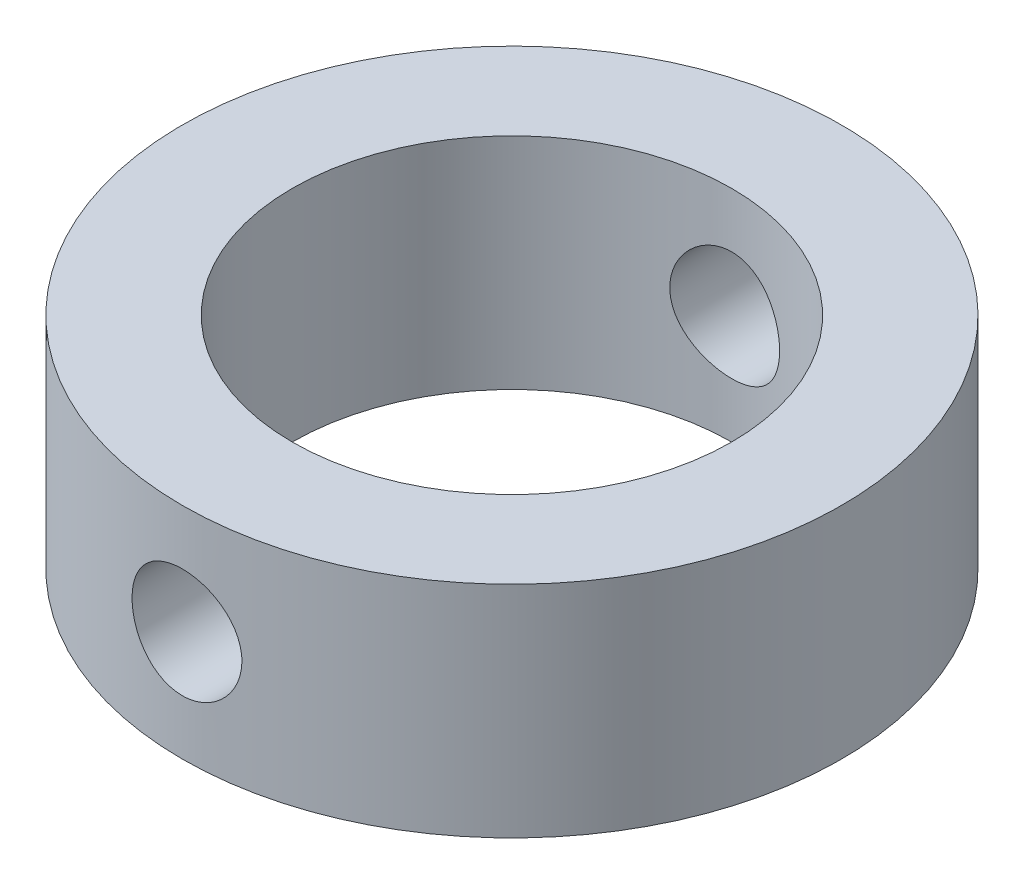
ISO-10303-21;
HEADER;
FILE_DESCRIPTION(('STEP AP214'),'2;1');
FILE_NAME('part.step','',(''),(''),'','','');
FILE_SCHEMA(('AUTOMOTIVE_DESIGN { 1 0 10303 214 1 1 1 1 }'));
ENDSEC;
DATA;
#1=APPLICATION_CONTEXT('core data for automotive mechanical design processes');
#2=APPLICATION_PROTOCOL_DEFINITION('international standard','automotive_design',2000,#1);
#3=PRODUCT_CONTEXT('',#1,'mechanical');
#4=PRODUCT('Part','Part','',(#3));
#5=PRODUCT_RELATED_PRODUCT_CATEGORY('part','',(#4));
#6=PRODUCT_DEFINITION_FORMATION('','',#4);
#7=PRODUCT_DEFINITION_CONTEXT('part definition',#1,'design');
#8=PRODUCT_DEFINITION('design','',#6,#7);
#9=PRODUCT_DEFINITION_SHAPE('','',#8);
#10=(LENGTH_UNIT() NAMED_UNIT(*) SI_UNIT(.MILLI.,.METRE.));
#11=(NAMED_UNIT(*) PLANE_ANGLE_UNIT() SI_UNIT($,.RADIAN.));
#12=(NAMED_UNIT(*) SI_UNIT($,.STERADIAN.) SOLID_ANGLE_UNIT());
#13=UNCERTAINTY_MEASURE_WITH_UNIT(LENGTH_MEASURE(1.E-05),#10,'distance_accuracy_value','');
#14=(GEOMETRIC_REPRESENTATION_CONTEXT(3) GLOBAL_UNCERTAINTY_ASSIGNED_CONTEXT((#13)) GLOBAL_UNIT_ASSIGNED_CONTEXT((#10,
#11,#12)) REPRESENTATION_CONTEXT('',''));
#15=CARTESIAN_POINT('',(0.,0.,0.));
#16=DIRECTION('',(0.,0.,1.));
#17=DIRECTION('',(1.,0.,0.));
#18=AXIS2_PLACEMENT_3D('',#15,#16,#17);
#19=CARTESIAN_POINT('',(0.,10.,0.));
#20=DIRECTION('',(0.,-1.,0.));
#21=DIRECTION('',(0.,0.,-1.));
#22=AXIS2_PLACEMENT_3D('',#19,#20,#21);
#23=CYLINDRICAL_SURFACE('',#22,15.);
#24=CARTESIAN_POINT('',(0.,7.49999999999995,-14.9999999999999));
#25=CARTESIAN_POINT('',(-0.139390904958217,7.49999441105213,-14.9999976116881));
#26=CARTESIAN_POINT('',(-0.278857881838825,7.48830272503106,-14.9980367791303));
#27=CARTESIAN_POINT('',(-0.553880221673049,7.4418643412347,-14.9904034494139));
#28=CARTESIAN_POINT('',(-0.689431867959253,7.40709644308843,-14.9847275392389));
#29=CARTESIAN_POINT('',(-0.952604747212641,7.31558455140728,-14.9703006823645));
#30=CARTESIAN_POINT('',(-1.08023236843189,7.25885853435945,-14.9615522515919));
#31=CARTESIAN_POINT('',(-1.32414184197793,7.12508770794761,-14.9419422708207));
#32=CARTESIAN_POINT('',(-1.44042498987857,7.04804522251701,-14.9310809625443));
#33=CARTESIAN_POINT('',(-1.65947261429168,6.87504491617954,-14.9083331745831));
#34=CARTESIAN_POINT('',(-1.76211290353498,6.77893088536387,-14.8964387181485));
#35=CARTESIAN_POINT('',(-1.94988849865994,6.57085203152717,-14.8730262687673));
#36=CARTESIAN_POINT('',(-2.03502269939099,6.45888620854337,-14.8615082996267));
#37=CARTESIAN_POINT('',(-2.18586712560515,6.22142903380292,-14.8400756575979));
#38=CARTESIAN_POINT('',(-2.25145455286102,6.09585866319524,-14.8301712909164));
#39=CARTESIAN_POINT('',(-2.36055836541121,5.83529043569937,-14.8131978979467));
#40=CARTESIAN_POINT('',(-2.40407624156556,5.70029321632236,-14.8061286801431));
#41=CARTESIAN_POINT('',(-2.46741437778476,5.42601972514344,-14.7957053684276));
#42=CARTESIAN_POINT('',(-2.48744902913539,5.28679426349859,-14.792317684857));
#43=CARTESIAN_POINT('',(-2.5039167252899,5.0069197231165,-14.7895393893665));
#44=CARTESIAN_POINT('',(-2.50035144038902,4.86627074583266,-14.7901484945722));
#45=CARTESIAN_POINT('',(-2.46989509839615,4.58907213872451,-14.7952642886356));
#46=CARTESIAN_POINT('',(-2.44324488188976,4.45249519645474,-14.7997307331892));
#47=CARTESIAN_POINT('',(-2.36775314040344,4.18577868217084,-14.8119949521101));
#48=CARTESIAN_POINT('',(-2.31891085431977,4.05563933111142,-14.8197928407328));
#49=CARTESIAN_POINT('',(-2.20017724609395,3.80477117655906,-14.8378847933411));
#50=CARTESIAN_POINT('',(-2.13018591387973,3.68409059391878,-14.8481906710733));
#51=CARTESIAN_POINT('',(-1.97121201755744,3.45609559946165,-14.8701291841501));
#52=CARTESIAN_POINT('',(-1.8822279206543,3.34878226754512,-14.8817619265428));
#53=CARTESIAN_POINT('',(-1.68648221215908,3.1491739141927,-14.9052202787978));
#54=CARTESIAN_POINT('',(-1.57951396387316,3.05708148145995,-14.9170464923165));
#55=CARTESIAN_POINT('',(-1.35153524898167,2.89212223733468,-14.9394260139672));
#56=CARTESIAN_POINT('',(-1.23052469190643,2.81925554981679,-14.9499793138974));
#57=CARTESIAN_POINT('',(-0.97770591616671,2.69479777286373,-14.9686389289291));
#58=CARTESIAN_POINT('',(-0.845888725564658,2.64322458066875,-14.9767431840745));
#59=CARTESIAN_POINT('',(-0.575298345602716,2.56300578475402,-14.9895750301266));
#60=CARTESIAN_POINT('',(-0.436525739179443,2.53435826302628,-14.9943029035047));
#61=CARTESIAN_POINT('',(-0.1577099013016,2.50107864153887,-14.9998112984268));
#62=CARTESIAN_POINT('',(-0.0177007371510007,2.49616842819439,-15.0006375301278));
#63=CARTESIAN_POINT('',(0.261139772889873,2.50976134442813,-14.9983747442117));
#64=CARTESIAN_POINT('',(0.399971163892011,2.52826357313376,-14.9952858772412));
#65=CARTESIAN_POINT('',(0.671656175546734,2.5879248493355,-14.985568269382));
#66=CARTESIAN_POINT('',(0.804540868385359,2.62894620839014,-14.9789610480131));
#67=CARTESIAN_POINT('',(1.06154688486045,2.73233451819952,-14.9629446445536));
#68=CARTESIAN_POINT('',(1.18566771590974,2.79470266763524,-14.9535353051201));
#69=CARTESIAN_POINT('',(1.42283068946898,2.93965112469677,-14.932845163024));
#70=CARTESIAN_POINT('',(1.53576525093716,3.02240515616727,-14.9215485588702));
#71=CARTESIAN_POINT('',(1.74624358550271,3.20553731538509,-14.898384673919));
#72=CARTESIAN_POINT('',(1.84378623969663,3.30591672327668,-14.8865173517155));
#73=CARTESIAN_POINT('',(2.02174277965805,3.52269754807143,-14.8634017523585));
#74=CARTESIAN_POINT('',(2.10196876111373,3.63925416551443,-14.8521611613711));
#75=CARTESIAN_POINT('',(2.24170231029498,3.88435296913855,-14.8317152977788));
#76=CARTESIAN_POINT('',(2.30121053476982,4.0128947752275,-14.8225099606602));
#77=CARTESIAN_POINT('',(2.39753833147314,4.27778973281212,-14.807234536977));
#78=CARTESIAN_POINT('',(2.43445143254793,4.41410809503047,-14.8011515431106));
#79=CARTESIAN_POINT('',(2.48483545377828,4.69112012922173,-14.7927771683526));
#80=CARTESIAN_POINT('',(2.4983084119462,4.83181341973201,-14.7904854578272));
#81=CARTESIAN_POINT('',(2.50137286604739,5.11170516596237,-14.7899673308401));
#82=CARTESIAN_POINT('',(2.4912601361252,5.25090037857526,-14.7916905650565));
#83=CARTESIAN_POINT('',(2.44807983895684,5.52557924805076,-14.7988978145373));
#84=CARTESIAN_POINT('',(2.41501234611246,5.66106291694188,-14.8043818176121));
#85=CARTESIAN_POINT('',(2.32697448959488,5.92435843729263,-14.8184735628172));
#86=CARTESIAN_POINT('',(2.27202959060042,6.05217901005605,-14.8270776721967));
#87=CARTESIAN_POINT('',(2.14182700391591,6.29683566919487,-14.8464436892221));
#88=CARTESIAN_POINT('',(2.06656830874858,6.41367121037216,-14.8572057038841));
#89=CARTESIAN_POINT('',(1.89681888437217,6.63453558310777,-14.8798345404563));
#90=CARTESIAN_POINT('',(1.80211056359365,6.73839601670027,-14.8917129557631));
#91=CARTESIAN_POINT('',(1.59660903138023,6.92885160447494,-14.9151437236084));
#92=CARTESIAN_POINT('',(1.48581211291265,7.01544276863821,-14.9266960002654));
#93=CARTESIAN_POINT('',(1.25036916964029,7.16944826819998,-14.9482652964222));
#94=CARTESIAN_POINT('',(1.12563278753281,7.23672603931296,-14.9582711625311));
#95=CARTESIAN_POINT('',(0.866513069378964,7.34926948460993,-14.9755116760177));
#96=CARTESIAN_POINT('',(0.73213949483,7.39455708107975,-14.9827490817747));
#97=CARTESIAN_POINT('',(0.497703310045395,7.45200527412671,-14.9920579083295));
#98=CARTESIAN_POINT('',(0.399058830298444,7.46997446961599,-14.9950202727336));
#99=CARTESIAN_POINT('',(0.200289310319808,7.49397373784473,-14.9989921598612));
#100=CARTESIAN_POINT('',(0.100164295608494,7.50000401613732,-15.0000017162063));
#101=CARTESIAN_POINT('',(0.,7.49999999999995,-14.9999999999999));
#102=B_SPLINE_CURVE_WITH_KNOTS('',3,(#24,#25,#26,#27,#28,#29,#30,#31,#32,#33,#34,#35,#36,#37,
#38,#39,#40,#41,#42,#43,#44,#45,#46,#47,#48,#49,#50,#51,#52,#53,#54,#55,#56,#57,#58,#59,#60,#61,
#62,#63,#64,#65,#66,#67,#68,#69,#70,#71,#72,#73,#74,#75,#76,#77,#78,#79,#80,#81,#82,#83,#84,#85,
#86,#87,#88,#89,#90,#91,#92,#93,#94,#95,#96,#97,#98,#99,#100,#101),.UNSPECIFIED.,.T.,.F.,(4,2,2,
2,2,2,2,2,2,2,2,2,2,2,2,2,2,2,2,2,2,2,2,2,2,2,2,2,2,2,2,2,2,2,2,2,2,2,4),(0.,0.417806584938513,
0.835997545695406,1.25384686702525,1.67164841267478,2.09302491062334,2.5144280016986,
2.93842520823841,3.3623937687618,3.78246077103425,4.2024980432089,4.61820521760411,
5.03392665025383,5.45164556632555,5.86939820680567,6.29232769911323,6.71525991635846,
7.13854688915903,7.56179844521151,7.98007883491396,8.39834313035855,8.81407807006413,
9.22983635826067,9.64926825627025,10.0687306305429,10.4925382200762,10.9163323737594,
11.3383602234177,11.7603513778661,12.177079095227,12.5938054618814,13.0100481822622,
13.4263115502934,13.8475138419339,14.2688133387897,14.693022316072,15.1168075213007,
15.4170424816402,15.7172722727697),.UNSPECIFIED.);
#103=CARTESIAN_POINT('',(0.,7.49999999999995,-14.9999999999999));
#104=VERTEX_POINT('',#103);
#105=EDGE_CURVE('E95',#104,#104,#102,.T.);
#106=ORIENTED_EDGE('',*,*,#105,.T.);
#107=EDGE_LOOP('',(#106));
#108=FACE_BOUND('',#107,.T.);
#109=CARTESIAN_POINT('',(2.49999999999995,5.,14.7901994577491));
#110=CARTESIAN_POINT('',(2.49999439841976,4.86062425183819,14.7902019736661));
#111=CARTESIAN_POINT('',(2.48830516902826,4.72117239392853,14.7921909238523));
#112=CARTESIAN_POINT('',(2.44187742806639,4.44618145673683,14.7999245720004));
#113=CARTESIAN_POINT('',(2.40711766030862,4.31064610624194,14.8056727334638));
#114=CARTESIAN_POINT('',(2.31562954367049,4.0475077166584,14.8202560936732));
#115=CARTESIAN_POINT('',(2.25891955493198,3.91989815133776,14.8290887118401));
#116=CARTESIAN_POINT('',(2.12518649688946,3.67601904528221,14.8488427210228));
#117=CARTESIAN_POINT('',(2.04816571350133,3.55974823042263,14.8597638769422));
#118=CARTESIAN_POINT('',(1.87518752696654,3.3406871502554,14.8825847115587));
#119=CARTESIAN_POINT('',(1.77906904893232,3.23802486861377,14.8944921732794));
#120=CARTESIAN_POINT('',(1.57097200469525,3.05020669313817,14.9178748066858));
#121=CARTESIAN_POINT('',(1.45899249914995,2.96505183688455,14.9293499527174));
#122=CARTESIAN_POINT('',(1.22152286994834,2.81418543278071,14.9506573698271));
#123=CARTESIAN_POINT('',(1.0959560814567,2.7485929922682,14.9604794243234));
#124=CARTESIAN_POINT('',(0.835395621723878,2.63947892946945,14.9772873695709));
#125=CARTESIAN_POINT('',(0.700402564078215,2.59595587211511,14.9842734447265));
#126=CARTESIAN_POINT('',(0.426143726344286,2.53260746501609,14.9945673472439));
#127=CARTESIAN_POINT('',(0.286928886679313,2.51256708399531,14.997908531109));
#128=CARTESIAN_POINT('',(0.00707528552583672,2.49608424584742,15.0006507934278));
#129=CARTESIAN_POINT('',(-0.133563378528861,2.49964018475278,15.0000521396932));
#130=CARTESIAN_POINT('',(-0.410802185078846,2.53008135152823,14.995008584314));
#131=CARTESIAN_POINT('',(-0.547428530700116,2.55673516340917,14.990601836924));
#132=CARTESIAN_POINT('',(-0.814241979611803,2.63225107424648,14.9784797877164));
#133=CARTESIAN_POINT('',(-0.944428886651547,2.68111384958946,14.9707643851322));
#134=CARTESIAN_POINT('',(-1.19535614778268,2.79989064031529,14.9528269851197));
#135=CARTESIAN_POINT('',(-1.31605052301905,2.86990001208245,14.9425936732688));
#136=CARTESIAN_POINT('',(-1.54406552984664,3.02891282263505,14.9207573807149));
#137=CARTESIAN_POINT('',(-1.65138507791591,3.11791779871077,14.9091542891914));
#138=CARTESIAN_POINT('',(-1.85097127344671,3.31367880661925,14.885702682326));
#139=CARTESIAN_POINT('',(-1.94303950225322,3.42063709490096,14.8738528973104));
#140=CARTESIAN_POINT('',(-2.10795458844804,3.64858709021583,14.851379597848));
#141=CARTESIAN_POINT('',(-2.18080126853238,3.76957892668284,14.8407560947132));
#142=CARTESIAN_POINT('',(-2.30524443448827,4.0223916418775,14.8219375456181));
#143=CARTESIAN_POINT('',(-2.35681702727925,4.15422449809211,14.813745233026));
#144=CARTESIAN_POINT('',(-2.43702987081562,4.42484907230757,14.8007618868988));
#145=CARTESIAN_POINT('',(-2.46567214076791,4.56364017643246,14.7959705538833));
#146=CARTESIAN_POINT('',(-2.49893188487922,4.84246615616217,14.7903895942213));
#147=CARTESIAN_POINT('',(-2.50383220791244,4.98246637970212,14.7895528575867));
#148=CARTESIAN_POINT('',(-2.49022270268246,5.2612866716908,14.7918503478236));
#149=CARTESIAN_POINT('',(-2.47171377862463,5.40010678551393,14.7949844213186));
#150=CARTESIAN_POINT('',(-2.41205233492806,5.67172775919081,14.8048268745503));
#151=CARTESIAN_POINT('',(-2.37104379064638,5.80456113987798,14.8115125191835));
#152=CARTESIAN_POINT('',(-2.26769819019231,6.06147016627946,14.827685730055));
#153=CARTESIAN_POINT('',(-2.20535985810097,6.18554528755087,14.8371734639058));
#154=CARTESIAN_POINT('',(-2.06045667322926,6.42267459440609,14.857991283974));
#155=CARTESIAN_POINT('',(-1.97771056415939,6.53561657275605,14.8693375560035));
#156=CARTESIAN_POINT('',(-1.79458946570798,6.74611353269499,14.8925466667987));
#157=CARTESIAN_POINT('',(-1.69421323638402,6.84366743110971,14.9044095418534));
#158=CARTESIAN_POINT('',(-1.47742807032877,7.02165189272868,14.9274642211827));
#159=CARTESIAN_POINT('',(-1.36086325338617,7.10189382628455,14.9386477634468));
#160=CARTESIAN_POINT('',(-1.1157434479493,7.24165532700492,14.9589511243294));
#161=CARTESIAN_POINT('',(-0.98718884747059,7.3011755644739,14.9680710096997));
#162=CARTESIAN_POINT('',(-0.722299051501287,7.3975105839549,14.9831835816957));
#163=CARTESIAN_POINT('',(-0.586000562602573,7.43442407573495,14.9891898456761));
#164=CARTESIAN_POINT('',(-0.309030734874174,7.48481559896383,14.9974558316929));
#165=CARTESIAN_POINT('',(-0.16835975682158,7.49829555873233,14.999715862002));
#166=CARTESIAN_POINT('',(0.111541275773708,7.50138188231217,15.0002303788782));
#167=CARTESIAN_POINT('',(0.250768160602686,7.49127525394107,14.9985330202419));
#168=CARTESIAN_POINT('',(0.525511974314703,7.44809607773059,14.9914217838733));
#169=CARTESIAN_POINT('',(0.661028923967465,7.41502365849036,14.9860079269519));
#170=CARTESIAN_POINT('',(0.924396445918518,7.32696183445639,14.9720698882741));
#171=CARTESIAN_POINT('',(1.05225537215381,7.27199683178999,14.9635491704088));
#172=CARTESIAN_POINT('',(1.29698045298214,7.14174206376941,14.9443275687803));
#173=CARTESIAN_POINT('',(1.41384608611817,7.06645133493751,14.933626581674));
#174=CARTESIAN_POINT('',(1.63471294552637,6.89666490753944,14.911076296164));
#175=CARTESIAN_POINT('',(1.73855143060276,6.80195904524871,14.8992152454112));
#176=CARTESIAN_POINT('',(1.92896387595096,6.59647169209616,14.8757630331437));
#177=CARTESIAN_POINT('',(2.01553378671195,6.48568644108743,14.8641719354951));
#178=CARTESIAN_POINT('',(2.1695142709109,6.25025467751034,14.8424834353391));
#179=CARTESIAN_POINT('',(2.23678498905773,6.12551566023447,14.8323971784578));
#180=CARTESIAN_POINT('',(2.34931453640428,5.86639076416181,14.8149921009131));
#181=CARTESIAN_POINT('',(2.39459535522306,5.73201467732259,14.8076705172487));
#182=CARTESIAN_POINT('',(2.45202605312742,5.49759623051258,14.7982474485648));
#183=CARTESIAN_POINT('',(2.4699874176714,5.39897319203737,14.7952462341946));
#184=CARTESIAN_POINT('',(2.49397629518131,5.20024651516306,14.7912213528807));
#185=CARTESIAN_POINT('',(2.50000402479273,5.1001429036758,14.7901976500369));
#186=CARTESIAN_POINT('',(2.49999999999995,5.,14.7901994577491));
#187=B_SPLINE_CURVE_WITH_KNOTS('',3,(#109,#110,#111,#112,#113,#114,#115,#116,#117,#118,#119,
#120,#121,#122,#123,#124,#125,#126,#127,#128,#129,#130,#131,#132,#133,#134,#135,#136,#137,#138,
#139,#140,#141,#142,#143,#144,#145,#146,#147,#148,#149,#150,#151,#152,#153,#154,#155,#156,#157,
#158,#159,#160,#161,#162,#163,#164,#165,#166,#167,#168,#169,#170,#171,#172,#173,#174,#175,#176,
#177,#178,#179,#180,#181,#182,#183,#184,#185,#186),.UNSPECIFIED.,.T.,.F.,(4,2,2,2,2,2,2,2,2,2,2,
2,2,2,2,2,2,2,2,2,2,2,2,2,2,2,2,2,2,2,2,2,2,2,2,2,2,2,4),(0.,0.417761038927738,
0.835907519962961,1.25370499787519,1.67145547405276,2.09289159155717,2.51435267834451,
2.93832980111435,3.36227935111109,3.78231567472561,4.20232344652688,4.61817121164668,
5.03403164249535,5.45179604139427,5.86959426226764,6.29246123462125,6.71533210746022,
7.13867662498607,7.56198385938082,7.98023542420411,8.39847083413972,8.81406064635488,
9.22967532293571,9.649123427627,10.0686010443069,10.4924411303538,10.916267504767,
11.3382298441765,11.7601574591235,12.1769777626592,12.5937957321882,13.0101503983245,
13.4265248039234,13.8476699746326,14.2689137888182,14.6931372761832,15.1169356674446,
15.4171067054377,15.7172722940182),.UNSPECIFIED.);
#188=CARTESIAN_POINT('',(2.49999999999995,5.,14.7901994577491));
#189=VERTEX_POINT('',#188);
#190=EDGE_CURVE('E88',#189,#189,#187,.T.);
#191=ORIENTED_EDGE('',*,*,#190,.T.);
#192=EDGE_LOOP('',(#191));
#193=FACE_BOUND('',#192,.T.);
#194=CARTESIAN_POINT('',(0.,10.,0.));
#195=DIRECTION('',(0.,1.,0.));
#196=DIRECTION('',(0.,0.,1.));
#197=AXIS2_PLACEMENT_3D('',#194,#195,#196);
#198=CIRCLE('',#197,15.);
#199=CARTESIAN_POINT('',(0.,10.,15.));
#200=VERTEX_POINT('',#199);
#201=EDGE_CURVE('E10',#200,#200,#198,.T.);
#202=ORIENTED_EDGE('',*,*,#201,.F.);
#203=EDGE_LOOP('',(#202));
#204=FACE_BOUND('',#203,.T.);
#205=CARTESIAN_POINT('',(0.,0.,0.));
#206=DIRECTION('',(0.,1.,0.));
#207=DIRECTION('',(0.,0.,1.));
#208=AXIS2_PLACEMENT_3D('',#205,#206,#207);
#209=CIRCLE('',#208,15.);
#210=CARTESIAN_POINT('',(0.,0.,15.));
#211=VERTEX_POINT('',#210);
#212=EDGE_CURVE('E54',#211,#211,#209,.T.);
#213=ORIENTED_EDGE('',*,*,#212,.T.);
#214=EDGE_LOOP('',(#213));
#215=FACE_BOUND('',#214,.T.);
#216=ADVANCED_FACE('F41',(#108,#193,#204,#215),#23,.T.);
#217=CARTESIAN_POINT('',(0.,10.,0.));
#218=DIRECTION('',(0.,1.,0.));
#219=DIRECTION('',(0.,0.,1.));
#220=AXIS2_PLACEMENT_3D('',#217,#218,#219);
#221=PLANE('',#220);
#222=CARTESIAN_POINT('',(0.,10.,0.));
#223=DIRECTION('',(0.,1.,0.));
#224=DIRECTION('',(0.,0.,1.));
#225=AXIS2_PLACEMENT_3D('',#222,#223,#224);
#226=CIRCLE('',#225,10.);
#227=CARTESIAN_POINT('',(0.,10.,10.));
#228=VERTEX_POINT('',#227);
#229=EDGE_CURVE('E63',#228,#228,#226,.T.);
#230=ORIENTED_EDGE('',*,*,#229,.F.);
#231=EDGE_LOOP('',(#230));
#232=FACE_BOUND('',#231,.T.);
#233=ORIENTED_EDGE('',*,*,#201,.T.);
#234=EDGE_LOOP('',(#233));
#235=FACE_BOUND('',#234,.T.);
#236=ADVANCED_FACE('F108',(#232,#235),#221,.T.);
#237=CARTESIAN_POINT('',(0.,0.,0.));
#238=DIRECTION('',(0.,1.,0.));
#239=DIRECTION('',(0.,0.,1.));
#240=AXIS2_PLACEMENT_3D('',#237,#238,#239);
#241=PLANE('',#240);
#242=CARTESIAN_POINT('',(0.,0.,0.));
#243=DIRECTION('',(0.,1.,0.));
#244=DIRECTION('',(0.,0.,1.));
#245=AXIS2_PLACEMENT_3D('',#242,#243,#244);
#246=CIRCLE('',#245,10.);
#247=CARTESIAN_POINT('',(0.,0.,10.));
#248=VERTEX_POINT('',#247);
#249=EDGE_CURVE('E65',#248,#248,#246,.T.);
#250=ORIENTED_EDGE('',*,*,#249,.T.);
#251=EDGE_LOOP('',(#250));
#252=FACE_BOUND('',#251,.T.);
#253=ORIENTED_EDGE('',*,*,#212,.F.);
#254=EDGE_LOOP('',(#253));
#255=FACE_BOUND('',#254,.T.);
#256=ADVANCED_FACE('F112',(#252,#255),#241,.F.);
#257=CARTESIAN_POINT('',(0.,0.,0.));
#258=DIRECTION('',(0.,1.,0.));
#259=DIRECTION('',(0.,0.,1.));
#260=AXIS2_PLACEMENT_3D('',#257,#258,#259);
#261=CYLINDRICAL_SURFACE('',#260,10.);
#262=CARTESIAN_POINT('',(0.,2.49999999999995,10.));
#263=CARTESIAN_POINT('',(0.13812681444954,2.50000387623021,9.99999766446687));
#264=CARTESIAN_POINT('',(0.276296929717914,2.5114859179563,9.99710963553043));
#265=CARTESIAN_POINT('',(0.548677206284179,2.55704191884502,9.98586856383158));
#266=CARTESIAN_POINT('',(0.682885078117852,2.59112868256307,9.9775124236663));
#267=CARTESIAN_POINT('',(0.943368120304257,2.68073208910344,9.95626043886723));
#268=CARTESIAN_POINT('',(1.06965260571665,2.73622299785875,9.94337004736764));
#269=CARTESIAN_POINT('',(1.31112021984069,2.86696898340808,9.91442239679369));
#270=CARTESIAN_POINT('',(1.42630297391457,2.94222472686499,9.89836503090265));
#271=CARTESIAN_POINT('',(1.64466987883484,3.11200131609035,9.86445689319493));
#272=CARTESIAN_POINT('',(1.74759281676843,3.20685262493179,9.84657845246878));
#273=CARTESIAN_POINT('',(1.93624821200554,3.41242034151506,9.81122700196559));
#274=CARTESIAN_POINT('',(2.02197872824863,3.52313853824492,9.79375403816447));
#275=CARTESIAN_POINT('',(2.17504423799826,3.75932537789502,9.76091292830282));
#276=CARTESIAN_POINT('',(2.24208702654188,3.88498871801456,9.74557990774685));
#277=CARTESIAN_POINT('',(2.3539948475846,4.14624735276671,9.71915824696694));
#278=CARTESIAN_POINT('',(2.39886342573363,4.28184105555334,9.70806892824032));
#279=CARTESIAN_POINT('',(2.46425806134132,4.55623916366941,9.69167461160541));
#280=CARTESIAN_POINT('',(2.48525378055343,4.69492482672997,9.68625818328355));
#281=CARTESIAN_POINT('',(2.50376962511067,4.97394761499891,9.68148937432649));
#282=CARTESIAN_POINT('',(2.50129356969688,5.11428446782023,9.68213600713204));
#283=CARTESIAN_POINT('',(2.47331087439955,5.38902634624225,9.68932009194685));
#284=CARTESIAN_POINT('',(2.44836390031775,5.52349270244221,9.69571438345487));
#285=CARTESIAN_POINT('',(2.37704031150497,5.78626841818506,9.7134451611845));
#286=CARTESIAN_POINT('',(2.33066217011562,5.91457733838149,9.72478199948729));
#287=CARTESIAN_POINT('',(2.21731579656195,6.16289669375351,9.75125189842761));
#288=CARTESIAN_POINT('',(2.15014444538821,6.28281028631594,9.7664221244969));
#289=CARTESIAN_POINT('',(1.99726046002492,6.50986451626136,9.79882851409987));
#290=CARTESIAN_POINT('',(1.91154458134804,6.61700291344538,9.81606503891053));
#291=CARTESIAN_POINT('',(1.721105707802,6.81867269282397,9.85126467566491));
#292=CARTESIAN_POINT('',(1.61591043027642,6.91275748343558,9.86923449130001));
#293=CARTESIAN_POINT('',(1.39101986250618,7.08203540410652,9.90343275964594));
#294=CARTESIAN_POINT('',(1.27132412951325,7.15722795710594,9.91966115915687));
#295=CARTESIAN_POINT('',(1.02019314780232,7.28675097704064,9.94862886823658));
#296=CARTESIAN_POINT('',(0.88871898868103,7.34100890042405,9.96135600212879));
#297=CARTESIAN_POINT('',(0.618126680238109,7.4265288428493,9.98179861652361));
#298=CARTESIAN_POINT('',(0.479009998584106,7.45779526069691,9.98951505565475));
#299=CARTESIAN_POINT('',(0.200899950650008,7.49576260926474,9.99892498785634));
#300=CARTESIAN_POINT('',(0.0619945333136518,7.50307171012551,10.0007675584713));
#301=CARTESIAN_POINT('',(-0.215054791335862,7.49458499657419,9.99864674690749));
#302=CARTESIAN_POINT('',(-0.353198766074329,7.47879126200143,9.99468388736412));
#303=CARTESIAN_POINT('',(-0.622690447960817,7.42504848601437,9.98149301878911));
#304=CARTESIAN_POINT('',(-0.754108531614592,7.38743122753839,9.97234390309646));
#305=CARTESIAN_POINT('',(-1.00876215408752,7.29148819328589,9.94981177723596));
#306=CARTESIAN_POINT('',(-1.13199686505439,7.23316032614459,9.93642833949961));
#307=CARTESIAN_POINT('',(-1.36920522404969,7.09627311854217,9.90655513210366));
#308=CARTESIAN_POINT('',(-1.48297573639295,7.01737314600572,9.89001445611001));
#309=CARTESIAN_POINT('',(-1.69587768940553,6.84201681867139,9.85574181979585));
#310=CARTESIAN_POINT('',(-1.79500659828873,6.74555743397057,9.83800965421567));
#311=CARTESIAN_POINT('',(-1.97831761345412,6.53499673192712,9.80281594932487));
#312=CARTESIAN_POINT('',(-2.06207311270184,6.4205204950007,9.78537173637462));
#313=CARTESIAN_POINT('',(-2.20918459835607,6.17877894255235,9.75321463970069));
#314=CARTESIAN_POINT('',(-2.27254149026904,6.05151419504925,9.73850163474933));
#315=CARTESIAN_POINT('',(-2.37658570101225,5.78849046265626,9.71363491194656));
#316=CARTESIAN_POINT('',(-2.41740732773931,5.65278728614616,9.70345425375806));
#317=CARTESIAN_POINT('',(-2.47557609990489,5.3761506035745,9.68877906706588));
#318=CARTESIAN_POINT('',(-2.49292837912653,5.23521824829759,9.68428329504046));
#319=CARTESIAN_POINT('',(-2.50339765056084,4.95646496023066,9.68158168701614));
#320=CARTESIAN_POINT('',(-2.49719649630133,4.81867094145593,9.68319887888036));
#321=CARTESIAN_POINT('',(-2.46229546385365,4.54616018555623,9.69213181672141));
#322=CARTESIAN_POINT('',(-2.43359603781095,4.41144338664469,9.69944744817726));
#323=CARTESIAN_POINT('',(-2.35488553240492,4.14965256822357,9.71885434473215));
#324=CARTESIAN_POINT('',(-2.30500234113403,4.02253782459946,9.73091692061053));
#325=CARTESIAN_POINT('',(-2.18544152267505,3.77839102881074,9.75846259540843));
#326=CARTESIAN_POINT('',(-2.11576115005698,3.66136037802189,9.77394616867816));
#327=CARTESIAN_POINT('',(-1.9564462477286,3.43740895166327,9.80709390439346));
#328=CARTESIAN_POINT('',(-1.86633860485378,3.33083154429342,9.82480441386306));
#329=CARTESIAN_POINT('',(-1.66964895198291,3.13408825867435,9.86013378743765));
#330=CARTESIAN_POINT('',(-1.56306303543527,3.04392628314506,9.87775262878415));
#331=CARTESIAN_POINT('',(-1.33411264450435,2.88098115239232,9.91129426079445));
#332=CARTESIAN_POINT('',(-1.21149737052734,2.80854231054738,9.92718055609783));
#333=CARTESIAN_POINT('',(-0.955443432517482,2.68542089509914,9.95508208291861));
#334=CARTESIAN_POINT('',(-0.822012605727916,2.63472273225245,9.96710008666296));
#335=CARTESIAN_POINT('',(-0.574017088739129,2.56404694945059,9.98413432609231));
#336=CARTESIAN_POINT('',(-0.46063361818012,2.54008126157763,9.99004308421149));
#337=CARTESIAN_POINT('',(-0.23151011922714,2.50805676063009,9.99797675386582));
#338=CARTESIAN_POINT('',(-0.115770268737694,2.49999675115778,10.0000019575149));
#339=CARTESIAN_POINT('',(0.,2.49999999999995,10.));
#340=B_SPLINE_CURVE_WITH_KNOTS('',3,(#262,#263,#264,#265,#266,#267,#268,#269,#270,#271,#272,
#273,#274,#275,#276,#277,#278,#279,#280,#281,#282,#283,#284,#285,#286,#287,#288,#289,#290,#291,
#292,#293,#294,#295,#296,#297,#298,#299,#300,#301,#302,#303,#304,#305,#306,#307,#308,#309,#310,
#311,#312,#313,#314,#315,#316,#317,#318,#319,#320,#321,#322,#323,#324,#325,#326,#327,#328,#329,
#330,#331,#332,#333,#334,#335,#336,#337,#338,#339),.UNSPECIFIED.,.T.,.F.,(4,2,2,2,2,2,2,2,2,2,2,
2,2,2,2,2,2,2,2,2,2,2,2,2,2,2,2,2,2,2,2,2,2,2,2,2,2,2,4),(0.,0.413956187453119,
0.828147062939779,1.24184150381016,1.65554990028223,2.07690725728566,2.4983121596677,
2.92597745909677,3.35357435282278,3.77260491835115,4.19156730193363,4.6003749501723,
5.00921172448929,5.42217546461999,5.83521151399139,6.26002501620566,6.68485149269278,
7.11113715020726,7.53734122819944,7.95263848254331,8.36789835193439,8.7770045752893,
9.18615212209351,9.60255979281121,10.0190393835223,10.44574182013,10.8724253125472,
11.2965375769764,11.7205570543047,12.1323963400748,12.5442273493652,12.9536066760887,
13.3630428023796,13.7831596069298,14.2033761629382,14.6312030917577,15.0587227304538,
15.4057040491338,15.7526592674819),.UNSPECIFIED.);
#341=CARTESIAN_POINT('',(0.,2.49999999999995,10.));
#342=VERTEX_POINT('',#341);
#343=EDGE_CURVE('E44',#342,#342,#340,.T.);
#344=ORIENTED_EDGE('',*,*,#343,.T.);
#345=EDGE_LOOP('',(#344));
#346=FACE_BOUND('',#345,.T.);
#347=CARTESIAN_POINT('',(2.49999999999995,5.,-9.68245836551862));
#348=CARTESIAN_POINT('',(2.49999607859301,4.86194924907342,-9.68246100087868));
#349=CARTESIAN_POINT('',(2.48852624549764,4.72385510132147,-9.68544306014599));
#350=CARTESIAN_POINT('',(2.4430231254638,4.45163242182649,-9.69701861992562));
#351=CARTESIAN_POINT('',(2.40897670674207,4.31750624553183,-9.70561538621631));
#352=CARTESIAN_POINT('',(2.31949119963199,4.05719646181284,-9.72738724596152));
#353=CARTESIAN_POINT('',(2.26407972785447,3.93100284461431,-9.74055642690458));
#354=CARTESIAN_POINT('',(2.13352114126142,3.68968914746013,-9.76998192028758));
#355=CARTESIAN_POINT('',(2.05837318856074,3.57456953791979,-9.78623836378488));
#356=CARTESIAN_POINT('',(1.88870842731193,3.3561383547378,-9.82040716355624));
#357=CARTESIAN_POINT('',(1.79383688770407,3.25310639964998,-9.83834597623032));
#358=CARTESIAN_POINT('',(1.58818206410068,3.06423860563967,-9.87362875515295));
#359=CARTESIAN_POINT('',(1.47739729418035,2.97840437437821,-9.89097266566394));
#360=CARTESIAN_POINT('',(1.241145201079,2.82522453236867,-9.92340415520588));
#361=CARTESIAN_POINT('',(1.11549457619512,2.75815361183852,-9.93845687400593));
#362=CARTESIAN_POINT('',(0.854263184292725,2.64619035584693,-9.96430811925983));
#363=CARTESIAN_POINT('',(0.7186838857919,2.6012947480845,-9.97510727334348));
#364=CARTESIAN_POINT('',(0.444358758754115,2.53585216542142,-9.99104758848185));
#365=CARTESIAN_POINT('',(0.305732719548926,2.51483035567341,-9.99629893844317));
#366=CARTESIAN_POINT('',(0.0268288192627162,2.49624162072445,-10.000935941073));
#367=CARTESIAN_POINT('',(-0.113448794538122,2.49867122779043,-10.000322460967));
#368=CARTESIAN_POINT('',(-0.388380617931014,2.52657485025019,-9.99338094953529));
#369=CARTESIAN_POINT('',(-0.523090539002705,2.55153632505389,-9.9871800234087));
#370=CARTESIAN_POINT('',(-0.78634561853424,2.62297127004849,-9.96990836524857));
#371=CARTESIAN_POINT('',(-0.914890448426113,2.66944588537738,-9.95883737398449));
#372=CARTESIAN_POINT('',(-1.16351675875452,2.78300257068704,-9.9328750970088));
#373=CARTESIAN_POINT('',(-1.28351127441626,2.85026704466173,-9.91795019695009));
#374=CARTESIAN_POINT('',(-1.51068905585121,3.00335567911626,-9.88589903809694));
#375=CARTESIAN_POINT('',(-1.61787008771375,3.08918306856063,-9.86877239652653));
#376=CARTESIAN_POINT('',(-1.81943508771238,3.27970874198236,-9.83363713769357));
#377=CARTESIAN_POINT('',(-1.91339419768799,3.38485489234773,-9.81561719525295));
#378=CARTESIAN_POINT('',(-2.08244093990754,3.60959997354028,-9.78115043517329));
#379=CARTESIAN_POINT('',(-2.15752769011503,3.72919957949113,-9.76470369108298));
#380=CARTESIAN_POINT('',(-2.28697032255643,3.98029003414889,-9.73520496829329));
#381=CARTESIAN_POINT('',(-2.34122391742611,4.11183573031281,-9.72216983717011));
#382=CARTESIAN_POINT('',(-2.42671405159097,4.38258546807682,-9.70118640148665));
#383=CARTESIAN_POINT('',(-2.45795551638268,4.52178786398457,-9.69323700842728));
#384=CARTESIAN_POINT('',(-2.49582963866594,4.7999595015299,-9.68355356007453));
#385=CARTESIAN_POINT('',(-2.50309047391911,4.93883779334101,-9.68166088976933));
#386=CARTESIAN_POINT('',(-2.49451699051517,5.21582193658526,-9.68387343364693));
#387=CARTESIAN_POINT('',(-2.47868479784985,5.35392785794946,-9.68797809570301));
#388=CARTESIAN_POINT('',(-2.4249254639383,5.62311426494858,-9.7015708198498));
#389=CARTESIAN_POINT('',(-2.38736406828192,5.7542727265692,-9.71096970242532));
#390=CARTESIAN_POINT('',(-2.29161808167046,6.00843145785331,-9.73400718262804));
#391=CARTESIAN_POINT('',(-2.23343104771251,6.13143075905576,-9.74764628246406));
#392=CARTESIAN_POINT('',(-2.09677066793661,6.36844127786689,-9.77796137095509));
#393=CARTESIAN_POINT('',(-2.01792175383564,6.48222884004299,-9.79469168607244));
#394=CARTESIAN_POINT('',(-1.8426507323361,6.69518836280151,-9.82917083071114));
#395=CARTESIAN_POINT('',(-1.74622573701356,6.79435791665015,-9.8469198272831));
#396=CARTESIAN_POINT('',(-1.53565680246177,6.97781104257097,-9.88197403031777));
#397=CARTESIAN_POINT('',(-1.42112988132893,7.06166006254884,-9.89925702061881));
#398=CARTESIAN_POINT('',(-1.17925670673665,7.20893586695128,-9.93097216613689));
#399=CARTESIAN_POINT('',(-1.05191112239395,7.27236371660824,-9.9454044700395));
#400=CARTESIAN_POINT('',(-0.788895504327704,7.37644603452795,-9.96970115738326));
#401=CARTESIAN_POINT('',(-0.653293452569681,7.41726428437907,-9.9795983002241));
#402=CARTESIAN_POINT('',(-0.376874400796998,7.47546033460843,-9.99385293395789));
#403=CARTESIAN_POINT('',(-0.236058412603089,7.49284265873908,-9.99821149393422));
#404=CARTESIAN_POINT('',(0.0427088161083087,7.50341897393889,-10.0008542352201));
#405=CARTESIAN_POINT('',(0.180634567415051,7.49725427273855,-9.99929947199968));
#406=CARTESIAN_POINT('',(0.453418741036861,7.46238043176411,-9.99064741143612));
#407=CARTESIAN_POINT('',(0.588277254452296,7.43367196246703,-9.98355027892934));
#408=CARTESIAN_POINT('',(0.850427589111921,7.35486945057281,-9.96463582134733));
#409=CARTESIAN_POINT('',(0.977756236452161,7.30489136671405,-9.95284411255983));
#410=CARTESIAN_POINT('',(1.22229263260408,7.18507355245107,-9.92578222284143));
#411=CARTESIAN_POINT('',(1.33949910316409,7.11523131832375,-9.91051160346898));
#412=CARTESIAN_POINT('',(1.56350482105828,6.95571191500962,-9.87768124200722));
#413=CARTESIAN_POINT('',(1.66998747074587,6.8655996427404,-9.8600754235416));
#414=CARTESIAN_POINT('',(1.86653755068379,6.66894287005661,-9.82476622642974));
#415=CARTESIAN_POINT('',(1.9566008126915,6.56239420972205,-9.80706282418262));
#416=CARTESIAN_POINT('',(2.11940506617961,6.3334964645263,-9.77318689613764));
#417=CARTESIAN_POINT('',(2.19179154854099,6.21088969158683,-9.75704909183225));
#418=CARTESIAN_POINT('',(2.31481724146367,5.95486127531292,-9.72859888737066));
#419=CARTESIAN_POINT('',(2.36547227438033,5.82144758476534,-9.71628370583029));
#420=CARTESIAN_POINT('',(2.43605632142747,5.57355747041206,-9.69879771876839));
#421=CARTESIAN_POINT('',(2.4599829264922,5.46026708903463,-9.69271657508744));
#422=CARTESIAN_POINT('',(2.49195573142942,5.23132782750578,-9.68454596456553));
#423=CARTESIAN_POINT('',(2.50000328592933,5.11567914938899,-9.68245615722777));
#424=CARTESIAN_POINT('',(2.49999999999995,5.,-9.68245836551862));
#425=B_SPLINE_CURVE_WITH_KNOTS('',3,(#347,#348,#349,#350,#351,#352,#353,#354,#355,#356,#357,
#358,#359,#360,#361,#362,#363,#364,#365,#366,#367,#368,#369,#370,#371,#372,#373,#374,#375,#376,
#377,#378,#379,#380,#381,#382,#383,#384,#385,#386,#387,#388,#389,#390,#391,#392,#393,#394,#395,
#396,#397,#398,#399,#400,#401,#402,#403,#404,#405,#406,#407,#408,#409,#410,#411,#412,#413,#414,
#415,#416,#417,#418,#419,#420,#421,#422,#423,#424),.UNSPECIFIED.,.T.,.F.,(4,2,2,2,2,2,2,2,2,2,2,
2,2,2,2,2,2,2,2,2,2,2,2,2,2,2,2,2,2,2,2,2,2,2,2,2,2,2,4),(0.,0.413727441736135,
0.827695741428662,1.24113072716599,1.65458326755473,2.07623954192973,2.49793521479866,
2.92551496397922,3.35303159847097,3.77188750995352,4.19068148666026,4.6001826268895,
5.00970556724786,5.42292874254444,5.83622385468912,6.2607046657191,6.68520531199801,
7.11176432008401,7.53823200129544,7.95343574764203,8.36860127188748,8.77697405014151,
9.1853952142636,9.60182845864105,10.0183301889,10.4452533097027,10.872154157245,
11.2959207281188,11.7196054891399,12.131834461324,12.5440511738193,12.9540487656466,
13.3640980574302,13.7839709658702,14.2039503157046,14.6317647729114,15.0592672137502,
15.4059782718573,15.7526597510791),.UNSPECIFIED.);
#426=CARTESIAN_POINT('',(2.49999999999995,5.,-9.68245836551862));
#427=VERTEX_POINT('',#426);
#428=EDGE_CURVE('E66',#427,#427,#425,.T.);
#429=ORIENTED_EDGE('',*,*,#428,.T.);
#430=EDGE_LOOP('',(#429));
#431=FACE_BOUND('',#430,.T.);
#432=ORIENTED_EDGE('',*,*,#249,.F.);
#433=EDGE_LOOP('',(#432));
#434=FACE_BOUND('',#433,.T.);
#435=ORIENTED_EDGE('',*,*,#229,.T.);
#436=EDGE_LOOP('',(#435));
#437=FACE_BOUND('',#436,.T.);
#438=ADVANCED_FACE('F71',(#346,#431,#434,#437),#261,.F.);
#439=CARTESIAN_POINT('',(0.,5.,-14.9999999999999));
#440=DIRECTION('',(0.,0.,1.));
#441=DIRECTION('',(1.,0.,0.));
#442=AXIS2_PLACEMENT_3D('',#439,#440,#441);
#443=CYLINDRICAL_SURFACE('',#442,2.5);
#444=ORIENTED_EDGE('',*,*,#428,.F.);
#445=EDGE_LOOP('',(#444));
#446=FACE_BOUND('',#445,.T.);
#447=ORIENTED_EDGE('',*,*,#105,.F.);
#448=EDGE_LOOP('',(#447));
#449=FACE_BOUND('',#448,.T.);
#450=ADVANCED_FACE('F77',(#446,#449),#443,.F.);
#451=ORIENTED_EDGE('',*,*,#343,.F.);
#452=EDGE_LOOP('',(#451));
#453=FACE_BOUND('',#452,.T.);
#454=ORIENTED_EDGE('',*,*,#190,.F.);
#455=EDGE_LOOP('',(#454));
#456=FACE_BOUND('',#455,.T.);
#457=ADVANCED_FACE('F76',(#453,#456),#443,.F.);
#458=CLOSED_SHELL('',(#216,#236,#256,#438,#450,#457));
#459=MANIFOLD_SOLID_BREP('B2',#458);
#460=ADVANCED_BREP_SHAPE_REPRESENTATION('',(#18,#459),#14);
#461=SHAPE_DEFINITION_REPRESENTATION(#9,#460);
ENDSEC;
END-ISO-10303-21;
